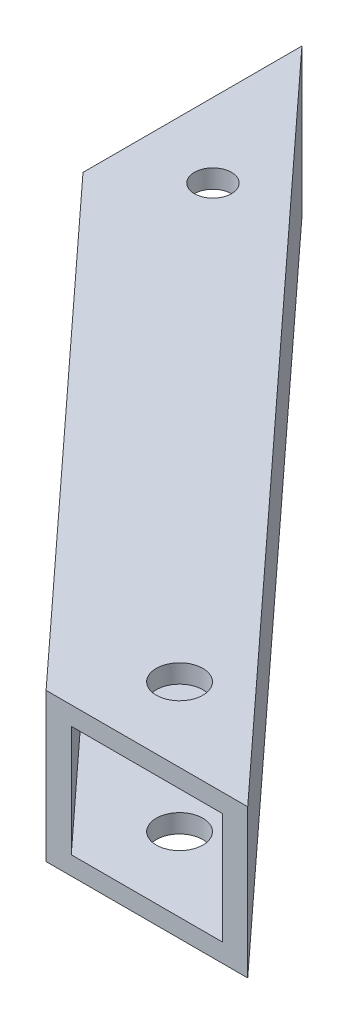
ISO-10303-21;
HEADER;
FILE_DESCRIPTION(('STEP AP214'),'2;1');
FILE_NAME('part.step','',(''),(''),'','','');
FILE_SCHEMA(('AUTOMOTIVE_DESIGN { 1 0 10303 214 1 1 1 1 }'));
ENDSEC;
DATA;
#1=APPLICATION_CONTEXT('core data for automotive mechanical design processes');
#2=APPLICATION_PROTOCOL_DEFINITION('international standard','automotive_design',2000,#1);
#3=PRODUCT_CONTEXT('',#1,'mechanical');
#4=PRODUCT('Part','Part','',(#3));
#5=PRODUCT_RELATED_PRODUCT_CATEGORY('part','',(#4));
#6=PRODUCT_DEFINITION_FORMATION('','',#4);
#7=PRODUCT_DEFINITION_CONTEXT('part definition',#1,'design');
#8=PRODUCT_DEFINITION('design','',#6,#7);
#9=PRODUCT_DEFINITION_SHAPE('','',#8);
#10=(LENGTH_UNIT() NAMED_UNIT(*) SI_UNIT(.MILLI.,.METRE.));
#11=(NAMED_UNIT(*) PLANE_ANGLE_UNIT() SI_UNIT($,.RADIAN.));
#12=(NAMED_UNIT(*) SI_UNIT($,.STERADIAN.) SOLID_ANGLE_UNIT());
#13=UNCERTAINTY_MEASURE_WITH_UNIT(LENGTH_MEASURE(1.E-05),#10,'distance_accuracy_value','');
#14=(GEOMETRIC_REPRESENTATION_CONTEXT(3) GLOBAL_UNCERTAINTY_ASSIGNED_CONTEXT((#13)) GLOBAL_UNIT_ASSIGNED_CONTEXT((#10,
#11,#12)) REPRESENTATION_CONTEXT('',''));
#15=CARTESIAN_POINT('',(0.,0.,0.));
#16=DIRECTION('',(0.,0.,1.));
#17=DIRECTION('',(1.,0.,0.));
#18=AXIS2_PLACEMENT_3D('',#15,#16,#17);
#19=CARTESIAN_POINT('',(0.,25.4,0.));
#20=DIRECTION('',(0.,0.,-1.));
#21=DIRECTION('',(-1.,0.,0.));
#22=AXIS2_PLACEMENT_3D('',#19,#20,#21);
#23=PLANE('',#22);
#24=DIRECTION('',(1.,0.,0.));
#25=VECTOR('',#24,1.);
#26=CARTESIAN_POINT('',(0.,0.,0.));
#27=LINE('',#26,#25);
#28=CARTESIAN_POINT('',(73.6598613160001,0.,0.));
#29=VERTEX_POINT('',#28);
#30=CARTESIAN_POINT('',(108.190600855836,0.,0.));
#31=VERTEX_POINT('',#30);
#32=EDGE_CURVE('E126',#29,#31,#27,.T.);
#33=ORIENTED_EDGE('',*,*,#32,.T.);
#34=DIRECTION('',(0.,-1.,0.));
#35=VECTOR('',#34,1.);
#36=CARTESIAN_POINT('',(108.190600855836,25.4,0.));
#37=LINE('',#36,#35);
#38=CARTESIAN_POINT('',(108.190600855836,25.4,0.));
#39=VERTEX_POINT('',#38);
#40=EDGE_CURVE('E141',#39,#31,#37,.T.);
#41=ORIENTED_EDGE('',*,*,#40,.F.);
#42=DIRECTION('',(1.,0.,0.));
#43=VECTOR('',#42,1.);
#44=CARTESIAN_POINT('',(0.,25.4,0.));
#45=LINE('',#44,#43);
#46=CARTESIAN_POINT('',(73.659861316,25.4000000000001,0.));
#47=VERTEX_POINT('',#46);
#48=EDGE_CURVE('E147',#47,#39,#45,.T.);
#49=ORIENTED_EDGE('',*,*,#48,.F.);
#50=DIRECTION('',(0.,-1.,0.));
#51=VECTOR('',#50,1.);
#52=CARTESIAN_POINT('',(73.659861316,25.4000000000001,0.));
#53=LINE('',#52,#51);
#54=EDGE_CURVE('E49',#47,#29,#53,.T.);
#55=ORIENTED_EDGE('',*,*,#54,.T.);
#56=EDGE_LOOP('',(#33,#41,#49,#55));
#57=FACE_BOUND('',#56,.T.);
#58=DIRECTION('',(-1.,0.,0.));
#59=VECTOR('',#58,1.);
#60=CARTESIAN_POINT('',(105.450044414763,3.175,0.));
#61=LINE('',#60,#59);
#62=CARTESIAN_POINT('',(103.874258413357,3.17500000000001,0.));
#63=VERTEX_POINT('',#62);
#64=CARTESIAN_POINT('',(77.9762037584795,3.17499999999998,0.));
#65=VERTEX_POINT('',#64);
#66=EDGE_CURVE('E153',#63,#65,#61,.T.);
#67=ORIENTED_EDGE('',*,*,#66,.T.);
#68=DIRECTION('',(0.,1.,0.));
#69=VECTOR('',#68,1.);
#70=CARTESIAN_POINT('',(77.9762037584795,3.17499999999998,0.));
#71=LINE('',#70,#69);
#72=CARTESIAN_POINT('',(77.9762037584796,22.225,0.));
#73=VERTEX_POINT('',#72);
#74=EDGE_CURVE('E156',#65,#73,#71,.T.);
#75=ORIENTED_EDGE('',*,*,#74,.T.);
#76=DIRECTION('',(1.,0.,0.));
#77=VECTOR('',#76,1.);
#78=CARTESIAN_POINT('',(105.450044414763,22.225,0.));
#79=LINE('',#78,#77);
#80=CARTESIAN_POINT('',(103.874258413357,22.225,0.));
#81=VERTEX_POINT('',#80);
#82=EDGE_CURVE('E133',#73,#81,#79,.T.);
#83=ORIENTED_EDGE('',*,*,#82,.T.);
#84=DIRECTION('',(0.,-1.,0.));
#85=VECTOR('',#84,1.);
#86=CARTESIAN_POINT('',(103.874258413357,3.17500000000001,0.));
#87=LINE('',#86,#85);
#88=EDGE_CURVE('E128',#81,#63,#87,.T.);
#89=ORIENTED_EDGE('',*,*,#88,.T.);
#90=EDGE_LOOP('',(#67,#75,#83,#89));
#91=FACE_BOUND('',#90,.T.);
#92=ADVANCED_FACE('F41',(#57,#91),#23,.F.);
#93=CARTESIAN_POINT('',(39.8553448051691,25.4,-36.7054581978103));
#94=DIRECTION('',(0.735576484560879,0.,-0.677441684103555));
#95=DIRECTION('',(-0.677441684103556,0.,-0.735576484560878));
#96=AXIS2_PLACEMENT_3D('',#93,#94,#95);
#97=PLANE('',#96);
#98=DIRECTION('',(0.677441684103556,0.,0.735576484560878));
#99=VECTOR('',#98,1.);
#100=CARTESIAN_POINT('',(39.8553448051691,25.4,-36.7054581978103));
#101=LINE('',#100,#99);
#102=CARTESIAN_POINT('',(0.,25.4,-79.9809977913651));
#103=VERTEX_POINT('',#102);
#104=EDGE_CURVE('E122',#103,#47,#101,.T.);
#105=ORIENTED_EDGE('',*,*,#104,.F.);
#106=DIRECTION('',(0.,1.,0.));
#107=VECTOR('',#106,1.);
#108=CARTESIAN_POINT('',(0.,0.,-79.9809977913651));
#109=LINE('',#108,#107);
#110=CARTESIAN_POINT('',(0.,0.,-79.9809977913651));
#111=VERTEX_POINT('',#110);
#112=EDGE_CURVE('E107',#111,#103,#109,.T.);
#113=ORIENTED_EDGE('',*,*,#112,.F.);
#114=DIRECTION('',(0.677441684103556,0.,0.735576484560878));
#115=VECTOR('',#114,1.);
#116=CARTESIAN_POINT('',(39.855344805169,0.,-36.7054581978103));
#117=LINE('',#116,#115);
#118=EDGE_CURVE('E120',#111,#29,#117,.T.);
#119=ORIENTED_EDGE('',*,*,#118,.T.);
#120=ORIENTED_EDGE('',*,*,#54,.F.);
#121=EDGE_LOOP('',(#105,#113,#119,#120));
#122=FACE_BOUND('',#121,.T.);
#123=ADVANCED_FACE('F43',(#122),#97,.F.);
#124=CARTESIAN_POINT('',(58.5389875130154,25.4,-53.9124769740406));
#125=DIRECTION('',(-0.735576484560879,0.,0.677441684103555));
#126=DIRECTION('',(0.677441684103556,0.,0.735576484560878));
#127=AXIS2_PLACEMENT_3D('',#124,#125,#126);
#128=PLANE('',#127);
#129=DIRECTION('',(-0.677441684103556,0.,-0.735576484560878));
#130=VECTOR('',#129,1.);
#131=CARTESIAN_POINT('',(58.5389875130154,0.,-53.9124769740406));
#132=LINE('',#131,#130);
#133=CARTESIAN_POINT('',(0.,0.,-117.475));
#134=VERTEX_POINT('',#133);
#135=EDGE_CURVE('E130',#31,#134,#132,.T.);
#136=ORIENTED_EDGE('',*,*,#135,.T.);
#137=DIRECTION('',(0.,-1.,0.));
#138=VECTOR('',#137,1.);
#139=CARTESIAN_POINT('',(0.,25.4,-117.475));
#140=LINE('',#139,#138);
#141=CARTESIAN_POINT('',(0.,25.4,-117.475));
#142=VERTEX_POINT('',#141);
#143=EDGE_CURVE('E110',#142,#134,#140,.T.);
#144=ORIENTED_EDGE('',*,*,#143,.F.);
#145=DIRECTION('',(-0.677441684103556,0.,-0.735576484560878));
#146=VECTOR('',#145,1.);
#147=CARTESIAN_POINT('',(58.5389875130154,25.4,-53.9124769740406));
#148=LINE('',#147,#146);
#149=EDGE_CURVE('E136',#39,#142,#148,.T.);
#150=ORIENTED_EDGE('',*,*,#149,.F.);
#151=ORIENTED_EDGE('',*,*,#40,.T.);
#152=EDGE_LOOP('',(#136,#144,#150,#151));
#153=FACE_BOUND('',#152,.T.);
#154=ADVANCED_FACE('F237',(#153),#128,.F.);
#155=CARTESIAN_POINT('',(0.,25.4,0.));
#156=DIRECTION('',(0.,1.,0.));
#157=DIRECTION('',(0.,0.,1.));
#158=AXIS2_PLACEMENT_3D('',#155,#156,#157);
#159=PLANE('',#158);
#160=CARTESIAN_POINT('',(12.7000000000001,25.4,-89.535));
#161=DIRECTION('',(0.,-1.,0.));
#162=DIRECTION('',(0.,0.,-1.));
#163=AXIS2_PLACEMENT_3D('',#160,#161,#162);
#164=CIRCLE('',#163,3.175);
#165=CARTESIAN_POINT('',(12.7000000000001,25.4,-92.71));
#166=VERTEX_POINT('',#165);
#167=EDGE_CURVE('E195',#166,#166,#164,.T.);
#168=ORIENTED_EDGE('',*,*,#167,.T.);
#169=EDGE_LOOP('',(#168));
#170=FACE_BOUND('',#169,.T.);
#171=CARTESIAN_POINT('',(83.8198613160001,25.4,-12.7));
#172=DIRECTION('',(0.,1.,0.));
#173=DIRECTION('',(0.,0.,1.));
#174=AXIS2_PLACEMENT_3D('',#171,#172,#173);
#175=CIRCLE('',#174,3.98826694877386);
#176=CARTESIAN_POINT('',(83.8198613160001,25.4,-8.71173305122615));
#177=VERTEX_POINT('',#176);
#178=EDGE_CURVE('E177',#177,#177,#175,.T.);
#179=ORIENTED_EDGE('',*,*,#178,.F.);
#180=EDGE_LOOP('',(#179));
#181=FACE_BOUND('',#180,.T.);
#182=DIRECTION('',(0.,0.,-1.));
#183=VECTOR('',#182,1.);
#184=CARTESIAN_POINT('',(0.,25.4,-117.475));
#185=LINE('',#184,#183);
#186=EDGE_CURVE('E115',#103,#142,#185,.T.);
#187=ORIENTED_EDGE('',*,*,#186,.F.);
#188=ORIENTED_EDGE('',*,*,#104,.T.);
#189=ORIENTED_EDGE('',*,*,#48,.T.);
#190=ORIENTED_EDGE('',*,*,#149,.T.);
#191=EDGE_LOOP('',(#187,#188,#189,#190));
#192=FACE_BOUND('',#191,.T.);
#193=ADVANCED_FACE('F228',(#170,#181,#192),#159,.T.);
#194=CARTESIAN_POINT('',(0.,0.,0.));
#195=DIRECTION('',(0.,1.,0.));
#196=DIRECTION('',(0.,0.,1.));
#197=AXIS2_PLACEMENT_3D('',#194,#195,#196);
#198=PLANE('',#197);
#199=CARTESIAN_POINT('',(12.7,0.,-89.535));
#200=DIRECTION('',(0.,-1.,0.));
#201=DIRECTION('',(0.,0.,-1.));
#202=AXIS2_PLACEMENT_3D('',#199,#200,#201);
#203=CIRCLE('',#202,3.175);
#204=CARTESIAN_POINT('',(12.7,0.,-92.71));
#205=VERTEX_POINT('',#204);
#206=EDGE_CURVE('E189',#205,#205,#203,.T.);
#207=ORIENTED_EDGE('',*,*,#206,.F.);
#208=EDGE_LOOP('',(#207));
#209=FACE_BOUND('',#208,.T.);
#210=CARTESIAN_POINT('',(83.8198613160002,0.,-12.7));
#211=DIRECTION('',(0.,1.,0.));
#212=DIRECTION('',(0.,0.,1.));
#213=AXIS2_PLACEMENT_3D('',#210,#211,#212);
#214=CIRCLE('',#213,3.98826694877386);
#215=CARTESIAN_POINT('',(83.8198613160002,0.,-8.71173305122615));
#216=VERTEX_POINT('',#215);
#217=EDGE_CURVE('E183',#216,#216,#214,.T.);
#218=ORIENTED_EDGE('',*,*,#217,.T.);
#219=EDGE_LOOP('',(#218));
#220=FACE_BOUND('',#219,.T.);
#221=ORIENTED_EDGE('',*,*,#118,.F.);
#222=DIRECTION('',(0.,0.,-1.));
#223=VECTOR('',#222,1.);
#224=CARTESIAN_POINT('',(0.,0.,-117.475));
#225=LINE('',#224,#223);
#226=EDGE_CURVE('E104',#111,#134,#225,.T.);
#227=ORIENTED_EDGE('',*,*,#226,.T.);
#228=ORIENTED_EDGE('',*,*,#135,.F.);
#229=ORIENTED_EDGE('',*,*,#32,.F.);
#230=EDGE_LOOP('',(#221,#227,#228,#229));
#231=FACE_BOUND('',#230,.T.);
#232=ADVANCED_FACE('F125',(#209,#220,#231),#198,.F.);
#233=CARTESIAN_POINT('',(105.450044414763,3.17500000000001,29.8315140646786));
#234=DIRECTION('',(0.,1.,0.));
#235=DIRECTION('',(0.,0.,1.));
#236=AXIS2_PLACEMENT_3D('',#233,#234,#235);
#237=PLANE('',#236);
#238=CARTESIAN_POINT('',(12.7000000000001,3.175,-89.535));
#239=DIRECTION('',(0.,-1.,0.));
#240=DIRECTION('',(0.,0.,-1.));
#241=AXIS2_PLACEMENT_3D('',#238,#239,#240);
#242=CIRCLE('',#241,3.175);
#243=CARTESIAN_POINT('',(12.7000000000001,3.175,-92.71));
#244=VERTEX_POINT('',#243);
#245=EDGE_CURVE('E186',#244,#244,#242,.T.);
#246=ORIENTED_EDGE('',*,*,#245,.T.);
#247=EDGE_LOOP('',(#246));
#248=FACE_BOUND('',#247,.T.);
#249=CARTESIAN_POINT('',(83.8198613160001,3.175,-12.7));
#250=DIRECTION('',(0.,1.,0.));
#251=DIRECTION('',(0.,0.,1.));
#252=AXIS2_PLACEMENT_3D('',#249,#250,#251);
#253=CIRCLE('',#252,3.98826694877386);
#254=CARTESIAN_POINT('',(83.8198613160001,3.175,-8.71173305122615));
#255=VERTEX_POINT('',#254);
#256=EDGE_CURVE('E180',#255,#255,#253,.T.);
#257=ORIENTED_EDGE('',*,*,#256,.F.);
#258=EDGE_LOOP('',(#257));
#259=FACE_BOUND('',#258,.T.);
#260=DIRECTION('',(0.,0.,-1.));
#261=VECTOR('',#260,1.);
#262=CARTESIAN_POINT('',(0.,3.17499999999998,29.8315140646787));
#263=LINE('',#262,#261);
#264=CARTESIAN_POINT('',(0.,3.17500000000001,-84.6677480674445));
#265=VERTEX_POINT('',#264);
#266=CARTESIAN_POINT('',(0.,3.17499999999998,-112.788249723921));
#267=VERTEX_POINT('',#266);
#268=EDGE_CURVE('E55',#265,#267,#263,.T.);
#269=ORIENTED_EDGE('',*,*,#268,.F.);
#270=DIRECTION('',(-0.677441684103556,0.,-0.735576484560878));
#271=VECTOR('',#270,1.);
#272=CARTESIAN_POINT('',(105.450044414763,3.17500000000001,29.8315140646786));
#273=LINE('',#272,#271);
#274=EDGE_CURVE('E163',#65,#265,#273,.T.);
#275=ORIENTED_EDGE('',*,*,#274,.F.);
#276=ORIENTED_EDGE('',*,*,#66,.F.);
#277=DIRECTION('',(-0.677441684103556,0.,-0.735576484560878));
#278=VECTOR('',#277,1.);
#279=CARTESIAN_POINT('',(119.462776445648,3.17500000000001,16.9262499825059));
#280=LINE('',#279,#278);
#281=EDGE_CURVE('E62',#63,#267,#280,.T.);
#282=ORIENTED_EDGE('',*,*,#281,.T.);
#283=EDGE_LOOP('',(#269,#275,#276,#282));
#284=FACE_BOUND('',#283,.T.);
#285=ADVANCED_FACE('F219',(#248,#259,#284),#237,.T.);
#286=CARTESIAN_POINT('',(105.450044414763,3.17500000000001,29.8315140646786));
#287=DIRECTION('',(0.735576484560879,0.,-0.677441684103555));
#288=DIRECTION('',(-0.677441684103556,0.,-0.735576484560878));
#289=AXIS2_PLACEMENT_3D('',#286,#287,#288);
#290=PLANE('',#289);
#291=DIRECTION('',(0.,-1.,0.));
#292=VECTOR('',#291,1.);
#293=CARTESIAN_POINT('',(0.,3.17500000000001,-84.6677480674445));
#294=LINE('',#293,#292);
#295=CARTESIAN_POINT('',(0.,22.225,-84.6677480674445));
#296=VERTEX_POINT('',#295);
#297=EDGE_CURVE('E172',#296,#265,#294,.T.);
#298=ORIENTED_EDGE('',*,*,#297,.F.);
#299=DIRECTION('',(-0.677441684103556,0.,-0.735576484560878));
#300=VECTOR('',#299,1.);
#301=CARTESIAN_POINT('',(105.450044414763,22.225,29.8315140646786));
#302=LINE('',#301,#300);
#303=EDGE_CURVE('E160',#73,#296,#302,.T.);
#304=ORIENTED_EDGE('',*,*,#303,.F.);
#305=ORIENTED_EDGE('',*,*,#74,.F.);
#306=ORIENTED_EDGE('',*,*,#274,.T.);
#307=EDGE_LOOP('',(#298,#304,#305,#306));
#308=FACE_BOUND('',#307,.T.);
#309=ADVANCED_FACE('F208',(#308),#290,.T.);
#310=CARTESIAN_POINT('',(105.450044414763,22.225,29.8315140646786));
#311=DIRECTION('',(0.,-1.,0.));
#312=DIRECTION('',(0.,0.,-1.));
#313=AXIS2_PLACEMENT_3D('',#310,#311,#312);
#314=PLANE('',#313);
#315=CARTESIAN_POINT('',(12.7000000000001,22.225,-89.535));
#316=DIRECTION('',(0.,-1.,0.));
#317=DIRECTION('',(0.,0.,-1.));
#318=AXIS2_PLACEMENT_3D('',#315,#316,#317);
#319=CIRCLE('',#318,3.175);
#320=CARTESIAN_POINT('',(12.7000000000001,22.225,-92.71));
#321=VERTEX_POINT('',#320);
#322=EDGE_CURVE('E192',#321,#321,#319,.T.);
#323=ORIENTED_EDGE('',*,*,#322,.F.);
#324=EDGE_LOOP('',(#323));
#325=FACE_BOUND('',#324,.T.);
#326=CARTESIAN_POINT('',(83.8198613160002,22.225,-12.7));
#327=DIRECTION('',(0.,1.,0.));
#328=DIRECTION('',(0.,0.,1.));
#329=AXIS2_PLACEMENT_3D('',#326,#327,#328);
#330=CIRCLE('',#329,3.98826694877386);
#331=CARTESIAN_POINT('',(83.8198613160002,22.225,-8.71173305122615));
#332=VERTEX_POINT('',#331);
#333=EDGE_CURVE('E175',#332,#332,#330,.T.);
#334=ORIENTED_EDGE('',*,*,#333,.T.);
#335=EDGE_LOOP('',(#334));
#336=FACE_BOUND('',#335,.T.);
#337=DIRECTION('',(0.,0.,1.));
#338=VECTOR('',#337,1.);
#339=CARTESIAN_POINT('',(0.,22.225,29.8315140646787));
#340=LINE('',#339,#338);
#341=CARTESIAN_POINT('',(0.,22.225,-112.788249723921));
#342=VERTEX_POINT('',#341);
#343=EDGE_CURVE('E123',#342,#296,#340,.T.);
#344=ORIENTED_EDGE('',*,*,#343,.F.);
#345=DIRECTION('',(-0.677441684103556,0.,-0.735576484560878));
#346=VECTOR('',#345,1.);
#347=CARTESIAN_POINT('',(119.462776445648,22.225,16.9262499825059));
#348=LINE('',#347,#346);
#349=EDGE_CURVE('E157',#81,#342,#348,.T.);
#350=ORIENTED_EDGE('',*,*,#349,.F.);
#351=ORIENTED_EDGE('',*,*,#82,.F.);
#352=ORIENTED_EDGE('',*,*,#303,.T.);
#353=EDGE_LOOP('',(#344,#350,#351,#352));
#354=FACE_BOUND('',#353,.T.);
#355=ADVANCED_FACE('F204',(#325,#336,#354),#314,.T.);
#356=CARTESIAN_POINT('',(119.462776445648,3.17500000000001,16.9262499825059));
#357=DIRECTION('',(-0.735576484560879,0.,0.677441684103555));
#358=DIRECTION('',(0.677441684103556,0.,0.735576484560878));
#359=AXIS2_PLACEMENT_3D('',#356,#357,#358);
#360=PLANE('',#359);
#361=DIRECTION('',(0.,1.,0.));
#362=VECTOR('',#361,1.);
#363=CARTESIAN_POINT('',(0.,3.17499999999998,-112.788249723921));
#364=LINE('',#363,#362);
#365=EDGE_CURVE('E11',#267,#342,#364,.T.);
#366=ORIENTED_EDGE('',*,*,#365,.F.);
#367=ORIENTED_EDGE('',*,*,#281,.F.);
#368=ORIENTED_EDGE('',*,*,#88,.F.);
#369=ORIENTED_EDGE('',*,*,#349,.T.);
#370=EDGE_LOOP('',(#366,#367,#368,#369));
#371=FACE_BOUND('',#370,.T.);
#372=ADVANCED_FACE('F207',(#371),#360,.T.);
#373=CARTESIAN_POINT('',(0.,0.,-117.475));
#374=DIRECTION('',(1.,0.,0.));
#375=DIRECTION('',(0.,0.,-1.));
#376=AXIS2_PLACEMENT_3D('',#373,#374,#375);
#377=PLANE('',#376);
#378=ORIENTED_EDGE('',*,*,#268,.T.);
#379=ORIENTED_EDGE('',*,*,#365,.T.);
#380=ORIENTED_EDGE('',*,*,#343,.T.);
#381=ORIENTED_EDGE('',*,*,#297,.T.);
#382=EDGE_LOOP('',(#378,#379,#380,#381));
#383=FACE_BOUND('',#382,.T.);
#384=ORIENTED_EDGE('',*,*,#186,.T.);
#385=ORIENTED_EDGE('',*,*,#143,.T.);
#386=ORIENTED_EDGE('',*,*,#226,.F.);
#387=ORIENTED_EDGE('',*,*,#112,.T.);
#388=EDGE_LOOP('',(#384,#385,#386,#387));
#389=FACE_BOUND('',#388,.T.);
#390=ADVANCED_FACE('F106',(#383,#389),#377,.F.);
#391=CARTESIAN_POINT('',(83.8198613160002,22.225,-12.7));
#392=DIRECTION('',(0.,1.,0.));
#393=DIRECTION('',(0.,0.,1.));
#394=AXIS2_PLACEMENT_3D('',#391,#392,#393);
#395=CYLINDRICAL_SURFACE('',#394,3.98826694877386);
#396=ORIENTED_EDGE('',*,*,#333,.F.);
#397=EDGE_LOOP('',(#396));
#398=FACE_BOUND('',#397,.T.);
#399=ORIENTED_EDGE('',*,*,#178,.T.);
#400=EDGE_LOOP('',(#399));
#401=FACE_BOUND('',#400,.T.);
#402=ADVANCED_FACE('F249',(#398,#401),#395,.F.);
#403=CARTESIAN_POINT('',(83.8198613160001,3.175,-12.7));
#404=DIRECTION('',(0.,-1.,0.));
#405=DIRECTION('',(0.,0.,-1.));
#406=AXIS2_PLACEMENT_3D('',#403,#404,#405);
#407=CYLINDRICAL_SURFACE('',#406,3.98826694877386);
#408=ORIENTED_EDGE('',*,*,#256,.T.);
#409=EDGE_LOOP('',(#408));
#410=FACE_BOUND('',#409,.T.);
#411=ORIENTED_EDGE('',*,*,#217,.F.);
#412=EDGE_LOOP('',(#411));
#413=FACE_BOUND('',#412,.T.);
#414=ADVANCED_FACE('F253',(#410,#413),#407,.F.);
#415=CARTESIAN_POINT('',(12.7000000000001,3.175,-89.535));
#416=DIRECTION('',(0.,-1.,0.));
#417=DIRECTION('',(0.,0.,-1.));
#418=AXIS2_PLACEMENT_3D('',#415,#416,#417);
#419=CYLINDRICAL_SURFACE('',#418,3.175);
#420=ORIENTED_EDGE('',*,*,#245,.F.);
#421=EDGE_LOOP('',(#420));
#422=FACE_BOUND('',#421,.T.);
#423=ORIENTED_EDGE('',*,*,#206,.T.);
#424=EDGE_LOOP('',(#423));
#425=FACE_BOUND('',#424,.T.);
#426=ADVANCED_FACE('F259',(#422,#425),#419,.F.);
#427=CARTESIAN_POINT('',(12.7000000000001,22.225,-89.535));
#428=DIRECTION('',(0.,1.,0.));
#429=DIRECTION('',(0.,0.,1.));
#430=AXIS2_PLACEMENT_3D('',#427,#428,#429);
#431=CYLINDRICAL_SURFACE('',#430,3.175);
#432=ORIENTED_EDGE('',*,*,#322,.T.);
#433=EDGE_LOOP('',(#432));
#434=FACE_BOUND('',#433,.T.);
#435=ORIENTED_EDGE('',*,*,#167,.F.);
#436=EDGE_LOOP('',(#435));
#437=FACE_BOUND('',#436,.T.);
#438=ADVANCED_FACE('F201',(#434,#437),#431,.F.);
#439=CLOSED_SHELL('',(#92,#123,#154,#193,#232,#285,#309,#355,#372,#390,#402,#414,#426,#438));
#440=MANIFOLD_SOLID_BREP('B2',#439);
#441=ADVANCED_BREP_SHAPE_REPRESENTATION('',(#18,#440),#14);
#442=SHAPE_DEFINITION_REPRESENTATION(#9,#441);
ENDSEC;
END-ISO-10303-21;
